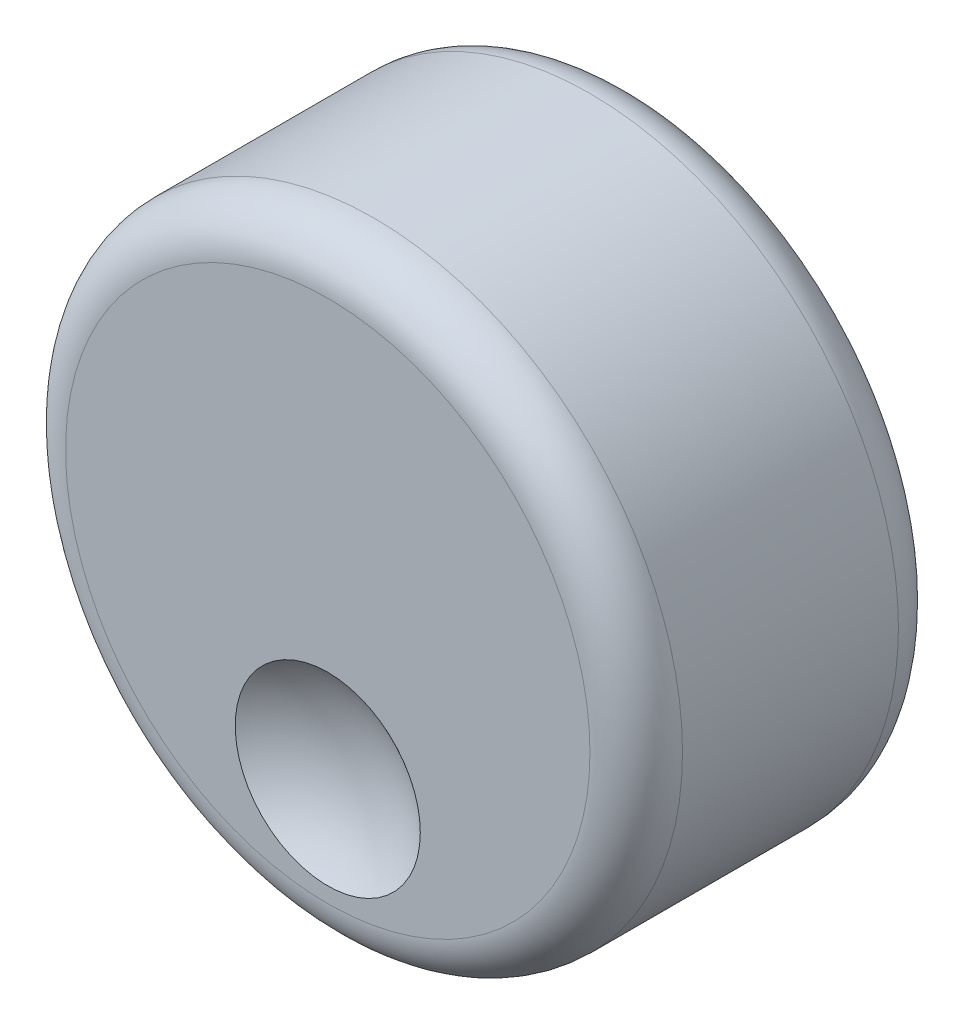
ISO-10303-21;
HEADER;
FILE_DESCRIPTION(('STEP AP214'),'2;1');
FILE_NAME('part.step','',(''),(''),'','','');
FILE_SCHEMA(('AUTOMOTIVE_DESIGN { 1 0 10303 214 1 1 1 1 }'));
ENDSEC;
DATA;
#1=APPLICATION_CONTEXT('core data for automotive mechanical design processes');
#2=APPLICATION_PROTOCOL_DEFINITION('international standard','automotive_design',2000,#1);
#3=PRODUCT_CONTEXT('',#1,'mechanical');
#4=PRODUCT('Part','Part','',(#3));
#5=PRODUCT_RELATED_PRODUCT_CATEGORY('part','',(#4));
#6=PRODUCT_DEFINITION_FORMATION('','',#4);
#7=PRODUCT_DEFINITION_CONTEXT('part definition',#1,'design');
#8=PRODUCT_DEFINITION('design','',#6,#7);
#9=PRODUCT_DEFINITION_SHAPE('','',#8);
#10=(LENGTH_UNIT() NAMED_UNIT(*) SI_UNIT(.MILLI.,.METRE.));
#11=(NAMED_UNIT(*) PLANE_ANGLE_UNIT() SI_UNIT($,.RADIAN.));
#12=(NAMED_UNIT(*) SI_UNIT($,.STERADIAN.) SOLID_ANGLE_UNIT());
#13=UNCERTAINTY_MEASURE_WITH_UNIT(LENGTH_MEASURE(1.E-05),#10,'distance_accuracy_value','');
#14=(GEOMETRIC_REPRESENTATION_CONTEXT(3) GLOBAL_UNCERTAINTY_ASSIGNED_CONTEXT((#13)) GLOBAL_UNIT_ASSIGNED_CONTEXT((#10,
#11,#12)) REPRESENTATION_CONTEXT('',''));
#15=CARTESIAN_POINT('',(0.,0.,0.));
#16=DIRECTION('',(0.,0.,1.));
#17=DIRECTION('',(1.,0.,0.));
#18=AXIS2_PLACEMENT_3D('',#15,#16,#17);
#19=CARTESIAN_POINT('',(0.,0.,10.));
#20=DIRECTION('',(0.,0.,-1.));
#21=DIRECTION('',(-1.,0.,0.));
#22=AXIS2_PLACEMENT_3D('',#19,#20,#21);
#23=CYLINDRICAL_SURFACE('',#22,10.);
#24=CARTESIAN_POINT('',(0.,0.,1.5));
#25=DIRECTION('',(0.,0.,1.));
#26=DIRECTION('',(1.,0.,0.));
#27=AXIS2_PLACEMENT_3D('',#24,#25,#26);
#28=CIRCLE('',#27,10.);
#29=CARTESIAN_POINT('',(10.,0.,1.5));
#30=VERTEX_POINT('',#29);
#31=EDGE_CURVE('E50',#30,#30,#28,.T.);
#32=ORIENTED_EDGE('',*,*,#31,.T.);
#33=EDGE_LOOP('',(#32));
#34=FACE_BOUND('',#33,.T.);
#35=CARTESIAN_POINT('',(0.,0.,8.5));
#36=DIRECTION('',(0.,0.,1.));
#37=DIRECTION('',(1.,0.,0.));
#38=AXIS2_PLACEMENT_3D('',#35,#36,#37);
#39=CIRCLE('',#38,10.);
#40=CARTESIAN_POINT('',(10.,0.,8.5));
#41=VERTEX_POINT('',#40);
#42=EDGE_CURVE('E53',#41,#41,#39,.F.);
#43=ORIENTED_EDGE('',*,*,#42,.T.);
#44=EDGE_LOOP('',(#43));
#45=FACE_BOUND('',#44,.T.);
#46=ADVANCED_FACE('F30',(#34,#45),#23,.T.);
#47=CARTESIAN_POINT('',(0.,0.,10.));
#48=DIRECTION('',(0.,0.,1.));
#49=DIRECTION('',(1.,0.,0.));
#50=AXIS2_PLACEMENT_3D('',#47,#48,#49);
#51=PLANE('',#50);
#52=CARTESIAN_POINT('',(0.,-5.,10.));
#53=DIRECTION('',(0.,0.,1.));
#54=DIRECTION('',(1.,0.,0.));
#55=AXIS2_PLACEMENT_3D('',#52,#53,#54);
#56=CIRCLE('',#55,3.);
#57=CARTESIAN_POINT('',(3.,-5.,10.));
#58=VERTEX_POINT('',#57);
#59=EDGE_CURVE('E34',#58,#58,#56,.T.);
#60=ORIENTED_EDGE('',*,*,#59,.F.);
#61=EDGE_LOOP('',(#60));
#62=FACE_BOUND('',#61,.T.);
#63=CARTESIAN_POINT('',(0.,0.,10.));
#64=DIRECTION('',(0.,0.,1.));
#65=DIRECTION('',(1.,0.,0.));
#66=AXIS2_PLACEMENT_3D('',#63,#64,#65);
#67=CIRCLE('',#66,8.5);
#68=CARTESIAN_POINT('',(8.5,0.,10.));
#69=VERTEX_POINT('',#68);
#70=EDGE_CURVE('E42',#69,#69,#67,.T.);
#71=ORIENTED_EDGE('',*,*,#70,.T.);
#72=EDGE_LOOP('',(#71));
#73=FACE_BOUND('',#72,.T.);
#74=ADVANCED_FACE('F65',(#62,#73),#51,.T.);
#75=CARTESIAN_POINT('',(0.,0.,0.));
#76=DIRECTION('',(0.,0.,1.));
#77=DIRECTION('',(1.,0.,0.));
#78=AXIS2_PLACEMENT_3D('',#75,#76,#77);
#79=PLANE('',#78);
#80=CARTESIAN_POINT('',(0.,0.,0.));
#81=DIRECTION('',(0.,0.,1.));
#82=DIRECTION('',(1.,0.,0.));
#83=AXIS2_PLACEMENT_3D('',#80,#81,#82);
#84=CIRCLE('',#83,4.00000000000001);
#85=CARTESIAN_POINT('',(4.00000000000001,0.,0.));
#86=VERTEX_POINT('',#85);
#87=EDGE_CURVE('E10',#86,#86,#84,.T.);
#88=ORIENTED_EDGE('',*,*,#87,.T.);
#89=EDGE_LOOP('',(#88));
#90=FACE_BOUND('',#89,.T.);
#91=CARTESIAN_POINT('',(0.,0.,0.));
#92=DIRECTION('',(0.,0.,1.));
#93=DIRECTION('',(1.,0.,0.));
#94=AXIS2_PLACEMENT_3D('',#91,#92,#93);
#95=CIRCLE('',#94,8.5);
#96=CARTESIAN_POINT('',(8.5,0.,0.));
#97=VERTEX_POINT('',#96);
#98=EDGE_CURVE('E47',#97,#97,#95,.F.);
#99=ORIENTED_EDGE('',*,*,#98,.T.);
#100=EDGE_LOOP('',(#99));
#101=FACE_BOUND('',#100,.T.);
#102=ADVANCED_FACE('F68',(#90,#101),#79,.F.);
#103=CARTESIAN_POINT('',(0.,0.,1.5));
#104=DIRECTION('',(0.,0.,1.));
#105=DIRECTION('',(1.,0.,0.));
#106=AXIS2_PLACEMENT_3D('',#103,#104,#105);
#107=TOROIDAL_SURFACE('',#106,8.5,1.5);
#108=ORIENTED_EDGE('',*,*,#98,.F.);
#109=EDGE_LOOP('',(#108));
#110=FACE_BOUND('',#109,.T.);
#111=ORIENTED_EDGE('',*,*,#31,.F.);
#112=EDGE_LOOP('',(#111));
#113=FACE_BOUND('',#112,.T.);
#114=ADVANCED_FACE('F75',(#110,#113),#107,.T.);
#115=CARTESIAN_POINT('',(0.,0.,8.5));
#116=DIRECTION('',(0.,0.,1.));
#117=DIRECTION('',(1.,0.,0.));
#118=AXIS2_PLACEMENT_3D('',#115,#116,#117);
#119=TOROIDAL_SURFACE('',#118,8.5,1.5);
#120=ORIENTED_EDGE('',*,*,#42,.F.);
#121=EDGE_LOOP('',(#120));
#122=FACE_BOUND('',#121,.T.);
#123=ORIENTED_EDGE('',*,*,#70,.F.);
#124=EDGE_LOOP('',(#123));
#125=FACE_BOUND('',#124,.T.);
#126=ADVANCED_FACE('F72',(#122,#125),#119,.T.);
#127=CARTESIAN_POINT('',(0.,0.,8.));
#128=DIRECTION('',(0.,0.,-1.));
#129=DIRECTION('',(-1.,0.,0.));
#130=AXIS2_PLACEMENT_3D('',#127,#128,#129);
#131=CYLINDRICAL_SURFACE('',#130,3.);
#132=CARTESIAN_POINT('',(0.,0.,1.));
#133=DIRECTION('',(0.,0.,1.));
#134=DIRECTION('',(1.,0.,0.));
#135=AXIS2_PLACEMENT_3D('',#132,#133,#134);
#136=CIRCLE('',#135,3.);
#137=CARTESIAN_POINT('',(3.,0.,1.));
#138=VERTEX_POINT('',#137);
#139=EDGE_CURVE('E38',#138,#138,#136,.F.);
#140=ORIENTED_EDGE('',*,*,#139,.T.);
#141=EDGE_LOOP('',(#140));
#142=FACE_BOUND('',#141,.T.);
#143=CARTESIAN_POINT('',(0.,0.,8.));
#144=DIRECTION('',(0.,0.,-1.));
#145=DIRECTION('',(-1.,0.,0.));
#146=AXIS2_PLACEMENT_3D('',#143,#144,#145);
#147=CIRCLE('',#146,3.);
#148=CARTESIAN_POINT('',(-3.,0.,8.));
#149=VERTEX_POINT('',#148);
#150=EDGE_CURVE('E56',#149,#149,#147,.T.);
#151=ORIENTED_EDGE('',*,*,#150,.F.);
#152=EDGE_LOOP('',(#151));
#153=FACE_BOUND('',#152,.T.);
#154=ADVANCED_FACE('F74',(#142,#153),#131,.F.);
#155=CARTESIAN_POINT('',(0.,0.,8.));
#156=DIRECTION('',(0.,0.,-1.));
#157=DIRECTION('',(-1.,0.,0.));
#158=AXIS2_PLACEMENT_3D('',#155,#156,#157);
#159=PLANE('',#158);
#160=ORIENTED_EDGE('',*,*,#150,.T.);
#161=EDGE_LOOP('',(#160));
#162=FACE_BOUND('',#161,.T.);
#163=ADVANCED_FACE('F81',(#162),#159,.T.);
#164=CARTESIAN_POINT('',(0.,0.,1.));
#165=DIRECTION('',(0.,0.,-1.));
#166=DIRECTION('',(-1.,0.,0.));
#167=AXIS2_PLACEMENT_3D('',#164,#165,#166);
#168=CONICAL_SURFACE('',#167,3.,0.785398163397451);
#169=ORIENTED_EDGE('',*,*,#87,.F.);
#170=EDGE_LOOP('',(#169));
#171=FACE_BOUND('',#170,.T.);
#172=ORIENTED_EDGE('',*,*,#139,.F.);
#173=EDGE_LOOP('',(#172));
#174=FACE_BOUND('',#173,.T.);
#175=ADVANCED_FACE('F32',(#171,#174),#168,.F.);
#176=CARTESIAN_POINT('',(0.,-5.,14.));
#177=DIRECTION('',(0.,0.,1.));
#178=DIRECTION('',(0.,1.,0.));
#179=AXIS2_PLACEMENT_3D('',#176,#177,#178);
#180=SPHERICAL_SURFACE('',#179,5.);
#181=ORIENTED_EDGE('',*,*,#59,.T.);
#182=EDGE_LOOP('',(#181));
#183=FACE_BOUND('',#182,.T.);
#184=ADVANCED_FACE('F63',(#183),#180,.F.);
#185=CLOSED_SHELL('',(#46,#74,#102,#114,#126,#154,#163,#175,#184));
#186=MANIFOLD_SOLID_BREP('B2',#185);
#187=ADVANCED_BREP_SHAPE_REPRESENTATION('',(#18,#186),#14);
#188=SHAPE_DEFINITION_REPRESENTATION(#9,#187);
ENDSEC;
END-ISO-10303-21;
